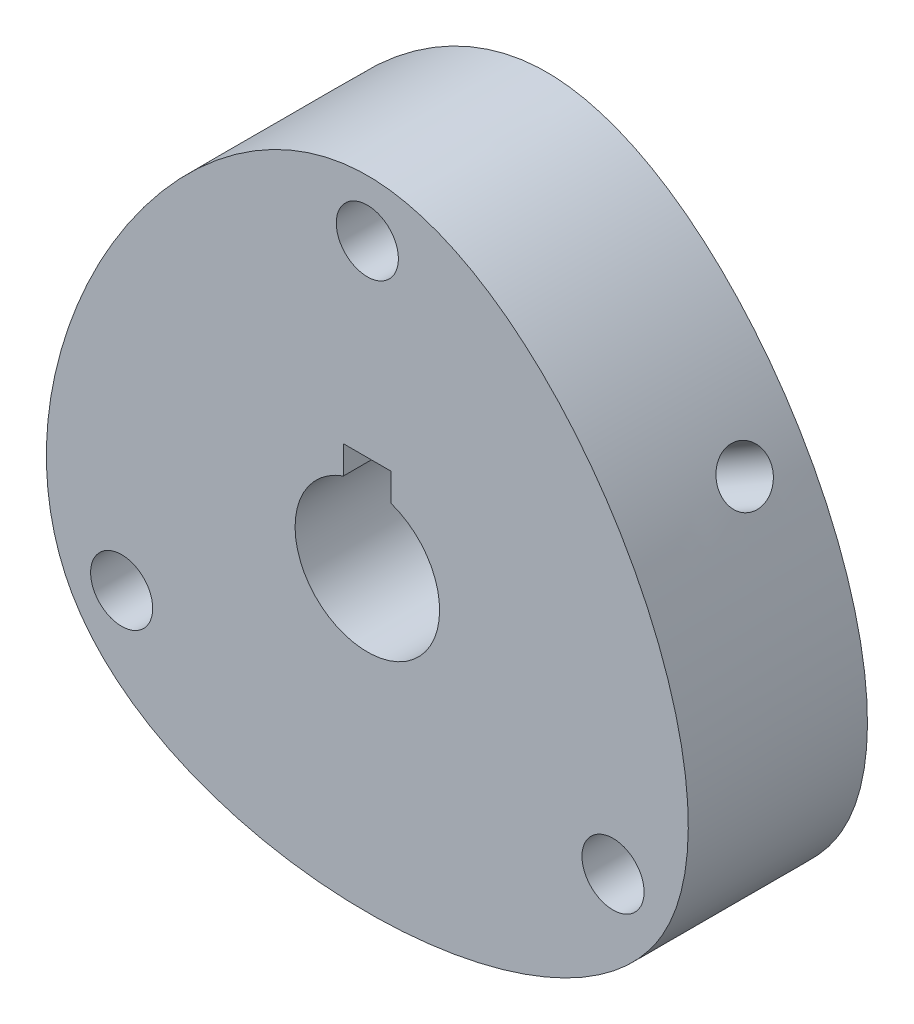
ISO-10303-21;
HEADER;
FILE_DESCRIPTION(('STEP AP214'),'2;1');
FILE_NAME('part.step','',(''),(''),'','','');
FILE_SCHEMA(('AUTOMOTIVE_DESIGN { 1 0 10303 214 1 1 1 1 }'));
ENDSEC;
DATA;
#1=APPLICATION_CONTEXT('core data for automotive mechanical design processes');
#2=APPLICATION_PROTOCOL_DEFINITION('international standard','automotive_design',2000,#1);
#3=PRODUCT_CONTEXT('',#1,'mechanical');
#4=PRODUCT('Part','Part','',(#3));
#5=PRODUCT_RELATED_PRODUCT_CATEGORY('part','',(#4));
#6=PRODUCT_DEFINITION_FORMATION('','',#4);
#7=PRODUCT_DEFINITION_CONTEXT('part definition',#1,'design');
#8=PRODUCT_DEFINITION('design','',#6,#7);
#9=PRODUCT_DEFINITION_SHAPE('','',#8);
#10=(LENGTH_UNIT() NAMED_UNIT(*) SI_UNIT(.MILLI.,.METRE.));
#11=(NAMED_UNIT(*) PLANE_ANGLE_UNIT() SI_UNIT($,.RADIAN.));
#12=(NAMED_UNIT(*) SI_UNIT($,.STERADIAN.) SOLID_ANGLE_UNIT());
#13=UNCERTAINTY_MEASURE_WITH_UNIT(LENGTH_MEASURE(1.E-05),#10,'distance_accuracy_value','');
#14=(GEOMETRIC_REPRESENTATION_CONTEXT(3) GLOBAL_UNCERTAINTY_ASSIGNED_CONTEXT((#13)) GLOBAL_UNIT_ASSIGNED_CONTEXT((#10,
#11,#12)) REPRESENTATION_CONTEXT('',''));
#15=CARTESIAN_POINT('',(0.,0.,0.));
#16=DIRECTION('',(0.,0.,1.));
#17=DIRECTION('',(1.,0.,0.));
#18=AXIS2_PLACEMENT_3D('',#15,#16,#17);
#19=CARTESIAN_POINT('',(0.,23.75,15.));
#20=DIRECTION('',(0.,0.,-1.));
#21=DIRECTION('',(-1.,0.,0.));
#22=AXIS2_PLACEMENT_3D('',#19,#20,#21);
#23=CYLINDRICAL_SURFACE('',#22,2.6);
#24=CARTESIAN_POINT('',(0.,23.75,15.));
#25=DIRECTION('',(0.,0.,1.));
#26=DIRECTION('',(1.,0.,0.));
#27=AXIS2_PLACEMENT_3D('',#24,#25,#26);
#28=CIRCLE('',#27,2.6);
#29=CARTESIAN_POINT('',(2.6,23.75,15.));
#30=VERTEX_POINT('',#29);
#31=EDGE_CURVE('E399',#30,#30,#28,.T.);
#32=ORIENTED_EDGE('',*,*,#31,.T.);
#33=EDGE_LOOP('',(#32));
#34=FACE_BOUND('',#33,.T.);
#35=CARTESIAN_POINT('',(0.,23.75,5.2));
#36=DIRECTION('',(0.,0.,-1.));
#37=DIRECTION('',(-1.,0.,0.));
#38=AXIS2_PLACEMENT_3D('',#35,#36,#37);
#39=CIRCLE('',#38,2.6);
#40=CARTESIAN_POINT('',(-2.6,23.75,5.2));
#41=VERTEX_POINT('',#40);
#42=EDGE_CURVE('E40',#41,#41,#39,.T.);
#43=ORIENTED_EDGE('',*,*,#42,.T.);
#44=EDGE_LOOP('',(#43));
#45=FACE_BOUND('',#44,.T.);
#46=ADVANCED_FACE('F35',(#34,#45),#23,.F.);
#47=CARTESIAN_POINT('',(-20.5681033398804,-11.875,15.));
#48=DIRECTION('',(0.,0.,-1.));
#49=DIRECTION('',(-1.,0.,0.));
#50=AXIS2_PLACEMENT_3D('',#47,#48,#49);
#51=CYLINDRICAL_SURFACE('',#50,2.6);
#52=CARTESIAN_POINT('',(-20.5681033398804,-11.875,15.));
#53=DIRECTION('',(0.,0.,1.));
#54=DIRECTION('',(1.,0.,0.));
#55=AXIS2_PLACEMENT_3D('',#52,#53,#54);
#56=CIRCLE('',#55,2.6);
#57=CARTESIAN_POINT('',(-17.9681033398804,-11.875,15.));
#58=VERTEX_POINT('',#57);
#59=EDGE_CURVE('E112',#58,#58,#56,.T.);
#60=ORIENTED_EDGE('',*,*,#59,.T.);
#61=EDGE_LOOP('',(#60));
#62=FACE_BOUND('',#61,.T.);
#63=CARTESIAN_POINT('',(-20.5681033398804,-11.875,5.2));
#64=DIRECTION('',(0.,0.,-1.));
#65=DIRECTION('',(-1.,0.,0.));
#66=AXIS2_PLACEMENT_3D('',#63,#64,#65);
#67=CIRCLE('',#66,2.6);
#68=CARTESIAN_POINT('',(-23.1681033398804,-11.875,5.2));
#69=VERTEX_POINT('',#68);
#70=EDGE_CURVE('E227',#69,#69,#67,.T.);
#71=ORIENTED_EDGE('',*,*,#70,.T.);
#72=EDGE_LOOP('',(#71));
#73=FACE_BOUND('',#72,.T.);
#74=ADVANCED_FACE('F125',(#62,#73),#51,.F.);
#75=CARTESIAN_POINT('',(20.5681033398804,-11.875,15.));
#76=DIRECTION('',(0.,0.,-1.));
#77=DIRECTION('',(-1.,0.,0.));
#78=AXIS2_PLACEMENT_3D('',#75,#76,#77);
#79=CYLINDRICAL_SURFACE('',#78,2.6);
#80=CARTESIAN_POINT('',(20.5681033398804,-11.875,15.));
#81=DIRECTION('',(0.,0.,1.));
#82=DIRECTION('',(1.,0.,0.));
#83=AXIS2_PLACEMENT_3D('',#80,#81,#82);
#84=CIRCLE('',#83,2.6);
#85=CARTESIAN_POINT('',(23.1681033398804,-11.875,15.));
#86=VERTEX_POINT('',#85);
#87=EDGE_CURVE('E183',#86,#86,#84,.T.);
#88=ORIENTED_EDGE('',*,*,#87,.T.);
#89=EDGE_LOOP('',(#88));
#90=FACE_BOUND('',#89,.T.);
#91=CARTESIAN_POINT('',(20.5681033398804,-11.875,5.2));
#92=DIRECTION('',(0.,0.,-1.));
#93=DIRECTION('',(-1.,0.,0.));
#94=AXIS2_PLACEMENT_3D('',#91,#92,#93);
#95=CIRCLE('',#94,2.6);
#96=CARTESIAN_POINT('',(17.9681033398804,-11.875,5.2));
#97=VERTEX_POINT('',#96);
#98=EDGE_CURVE('E141',#97,#97,#95,.T.);
#99=ORIENTED_EDGE('',*,*,#98,.T.);
#100=EDGE_LOOP('',(#99));
#101=FACE_BOUND('',#100,.T.);
#102=ADVANCED_FACE('F199',(#90,#101),#79,.F.);
#103=CARTESIAN_POINT('',(0.,0.,15.));
#104=DIRECTION('',(0.,0.,-1.));
#105=DIRECTION('',(-1.,0.,0.));
#106=AXIS2_PLACEMENT_3D('',#103,#104,#105);
#107=CYLINDRICAL_SURFACE('',#106,6.05);
#108=CARTESIAN_POINT('',(5.97244831519435,0.965588484983228,5.));
#109=CARTESIAN_POINT('',(5.97244771981132,0.965585419713385,5.11659586544028));
#110=CARTESIAN_POINT('',(5.97084696948032,0.975652573765686,5.23317539328625));
#111=CARTESIAN_POINT('',(5.96422678073495,1.0153307451302,5.46284883688186));
#112=CARTESIAN_POINT('',(5.95920714520985,1.04494288927667,5.57594255126916));
#113=CARTESIAN_POINT('',(5.94516620442357,1.12205854814759,5.79527277586522));
#114=CARTESIAN_POINT('',(5.93615361852759,1.16952304494284,5.90152365281275));
#115=CARTESIAN_POINT('',(5.91327061552294,1.28020047395786,6.10490377429607));
#116=CARTESIAN_POINT('',(5.89939891241414,1.3434175739371,6.20203059544692));
#117=CARTESIAN_POINT('',(5.86513679276748,1.48601825471943,6.38873234440809));
#118=CARTESIAN_POINT('',(5.84450523150246,1.56595266070364,6.47784242289391));
#119=CARTESIAN_POINT('',(5.79584765984202,1.73740692640381,6.64178119514703));
#120=CARTESIAN_POINT('',(5.76782027254636,1.82892894176309,6.71660722514055));
#121=CARTESIAN_POINT('',(5.70254189281029,2.02344695255257,6.85202948964839));
#122=CARTESIAN_POINT('',(5.66503852831487,2.1267055014499,6.91212927946174));
#123=CARTESIAN_POINT('',(5.58084051304245,2.33874012089978,7.0130893564337));
#124=CARTESIAN_POINT('',(5.53414870852933,2.44751447511884,7.05395558822756));
#125=CARTESIAN_POINT('',(5.43391247084311,2.66244213100865,7.11368448649912));
#126=CARTESIAN_POINT('',(5.38070763625974,2.76853146474855,7.13334551320456));
#127=CARTESIAN_POINT('',(5.26724956321482,2.97872940348406,7.15265447122058));
#128=CARTESIAN_POINT('',(5.20699838990949,3.0828385784806,7.15230825170187));
#129=CARTESIAN_POINT('',(5.0841597840251,3.28128665504444,7.13209763001628));
#130=CARTESIAN_POINT('',(5.02179563787072,3.37585417227358,7.1131024992434));
#131=CARTESIAN_POINT('',(4.89453708844871,3.55785661367906,7.0575834744504));
#132=CARTESIAN_POINT('',(4.82964250910467,3.64529104019624,7.02105835862552));
#133=CARTESIAN_POINT('',(4.69886122884479,3.81243106385862,6.93106330844271));
#134=CARTESIAN_POINT('',(4.63297332805241,3.892011685249,6.87736387682733));
#135=CARTESIAN_POINT('',(4.50374905126712,4.04085060858665,6.75474038151916));
#136=CARTESIAN_POINT('',(4.44041345487007,4.11010577382511,6.68581170714428));
#137=CARTESIAN_POINT('',(4.31574925558461,4.24092033146412,6.53040329005567));
#138=CARTESIAN_POINT('',(4.25470525957844,4.30187674715703,6.44318657796364));
#139=CARTESIAN_POINT('',(4.14152518925484,4.41094795305225,6.25585600479975));
#140=CARTESIAN_POINT('',(4.08939090684025,4.45906016114569,6.15573955644468));
#141=CARTESIAN_POINT('',(3.99623065767715,4.54275775188828,5.94308249055152));
#142=CARTESIAN_POINT('',(3.95542334979798,4.57810006752653,5.83034944371705));
#143=CARTESIAN_POINT('',(3.8890992223321,4.63457954224353,5.59710300049913));
#144=CARTESIAN_POINT('',(3.86357492841652,4.65572364573236,5.47659343930491));
#145=CARTESIAN_POINT('',(3.83070653238309,4.68280052508061,5.23772262205738));
#146=CARTESIAN_POINT('',(3.82251046474467,4.68944667794386,5.11955953806098));
#147=CARTESIAN_POINT('',(3.82238691750951,4.68954815163417,4.88323348212841));
#148=CARTESIAN_POINT('',(3.83045593962798,4.68300630892661,4.76507051563309));
#149=CARTESIAN_POINT('',(3.8615585275753,4.65738530989887,4.53715060541383));
#150=CARTESIAN_POINT('',(3.88396664694414,4.6388297881963,4.42724751138682));
#151=CARTESIAN_POINT('',(3.94162349910131,4.58993713257892,4.21361329437768));
#152=CARTESIAN_POINT('',(3.97687469636521,4.55959773736682,4.10988336041888));
#153=CARTESIAN_POINT('',(4.05953287774042,4.48618338105912,3.90752765365013));
#154=CARTESIAN_POINT('',(4.10732060143038,4.4427015168377,3.80920564627256));
#155=CARTESIAN_POINT('',(4.21176652798219,4.34381026702985,3.62391143962561));
#156=CARTESIAN_POINT('',(4.26842767929386,4.28839691456284,3.53694303058937));
#157=CARTESIAN_POINT('',(4.3912290648617,4.16266019483474,3.37179358243095));
#158=CARTESIAN_POINT('',(4.45772200792917,4.09167683694986,3.29437483125167));
#159=CARTESIAN_POINT('',(4.59429708701993,3.93770360650056,3.15645987818752));
#160=CARTESIAN_POINT('',(4.66437915695601,3.85471395495882,3.09596336484297));
#161=CARTESIAN_POINT('',(4.80453127458454,3.67852809255095,2.99409991418072));
#162=CARTESIAN_POINT('',(4.874599440804,3.58538795144162,2.95263388366826));
#163=CARTESIAN_POINT('',(5.01199254535893,3.3906638634777,2.88995298464641));
#164=CARTESIAN_POINT('',(5.07931861489483,3.28908345216744,2.86872968269049));
#165=CARTESIAN_POINT('',(5.20510028219489,3.08592782907337,2.84797500158163));
#166=CARTESIAN_POINT('',(5.26383671324706,2.98463655226482,2.84735560826681));
#167=CARTESIAN_POINT('',(5.37466335455287,2.78011117061156,2.86508321951115));
#168=CARTESIAN_POINT('',(5.42675423295139,2.67687726227879,2.88342831568673));
#169=CARTESIAN_POINT('',(5.52225567920012,2.47377186816294,2.93781736398546));
#170=CARTESIAN_POINT('',(5.5658195525842,2.37387449049164,2.97349850306937));
#171=CARTESIAN_POINT('',(5.64523880026349,2.17828660232481,3.06119873936777));
#172=CARTESIAN_POINT('',(5.6810927305372,2.08259688256101,3.11322089266456));
#173=CARTESIAN_POINT('',(5.74661089553961,1.89453845598762,3.23449818636999));
#174=CARTESIAN_POINT('',(5.77597167770284,1.80245387516408,3.30435724114969));
#175=CARTESIAN_POINT('',(5.82734665486087,1.62872721644777,3.45833794756986));
#176=CARTESIAN_POINT('',(5.84935834341526,1.54708870707599,3.54246445046468));
#177=CARTESIAN_POINT('',(5.88787712480879,1.39354339266074,3.7272170059704));
#178=CARTESIAN_POINT('',(5.90408359778167,1.32225889809042,3.82842499247325));
#179=CARTESIAN_POINT('',(5.93071957249091,1.1971525249264,4.04182481914493));
#180=CARTESIAN_POINT('',(5.94114955462423,1.14332919434407,4.15401574501349));
#181=CARTESIAN_POINT('',(5.95732407941024,1.05583546361744,4.3864066902539));
#182=CARTESIAN_POINT('',(5.96306707770131,1.0221717070266,4.5066093353878));
#183=CARTESIAN_POINT('',(5.97062855500023,0.977055275373253,4.75121557224694));
#184=CARTESIAN_POINT('',(5.97244895034105,0.965591754972302,4.8756170824911));
#185=CARTESIAN_POINT('',(5.97244831519435,0.965588484983228,5.));
#186=B_SPLINE_CURVE_WITH_KNOTS('',3,(#108,#109,#110,#111,#112,#113,#114,#115,#116,#117,#118,
#119,#120,#121,#122,#123,#124,#125,#126,#127,#128,#129,#130,#131,#132,#133,#134,#135,#136,#137,
#138,#139,#140,#141,#142,#143,#144,#145,#146,#147,#148,#149,#150,#151,#152,#153,#154,#155,#156,
#157,#158,#159,#160,#161,#162,#163,#164,#165,#166,#167,#168,#169,#170,#171,#172,#173,#174,#175,
#176,#177,#178,#179,#180,#181,#182,#183,#184,#185),.UNSPECIFIED.,.T.,.F.,(4,2,2,2,2,2,2,2,2,2,2,
2,2,2,2,2,2,2,2,2,2,2,2,2,2,2,2,2,2,2,2,2,2,2,2,2,2,2,4),(0.,0.349325657481159,0.69867145651791,
1.04725812413832,1.39593711750423,1.75873049447988,2.121591461357,2.49538102610081,
2.86905498538956,3.22810840741912,3.58705685977379,3.93003161639104,4.27303028113269,
4.62081862153457,4.9687124001496,5.33505757214899,5.70147633623193,6.07454190109645,
6.44742486473319,6.80150211123779,7.1555032111669,7.49502796165894,7.83461789835866,
8.18603987565901,8.53757887168226,8.90875587121735,9.27992603866123,9.64914093230714,
10.0182019378104,10.3677414580296,10.7172458077501,11.0597316712173,11.4022816242666,
11.7584767536817,12.1147932411979,12.4875396332954,12.8602550215989,13.2330931701314,
13.6057491324518),.UNSPECIFIED.);
#187=CARTESIAN_POINT('',(5.97244831519435,0.965588484983228,5.));
#188=VERTEX_POINT('',#187);
#189=EDGE_CURVE('E140',#188,#188,#186,.T.);
#190=ORIENTED_EDGE('',*,*,#189,.F.);
#191=EDGE_LOOP('',(#190));
#192=FACE_BOUND('',#191,.T.);
#193=CARTESIAN_POINT('',(0.,-6.05,7.15));
#194=CARTESIAN_POINT('',(0.11685954706425,-6.05000162471605,7.15000227279329));
#195=CARTESIAN_POINT('',(0.233702893841438,-6.04658384068489,7.1404420271531));
#196=CARTESIAN_POINT('',(0.463921462027798,-6.03328868591722,7.10258993810885));
#197=CARTESIAN_POINT('',(0.577296779091105,-6.02341149351062,7.07429861182799));
#198=CARTESIAN_POINT('',(0.79722699269495,-5.99826411294486,7.00009513692555));
#199=CARTESIAN_POINT('',(0.903793804957312,-5.98300366951455,6.95421481486329));
#200=CARTESIAN_POINT('',(1.10771594043303,-5.94862775927551,6.84628890806543));
#201=CARTESIAN_POINT('',(1.20506907698182,-5.92951138069878,6.78423949899963));
#202=CARTESIAN_POINT('',(1.39157075002002,-5.88858799584403,6.64321986969979));
#203=CARTESIAN_POINT('',(1.48031415377872,-5.8667103511561,6.56373450945163));
#204=CARTESIAN_POINT('',(1.64352981314482,-5.82309712706986,6.39119338695876));
#205=CARTESIAN_POINT('',(1.71799832270236,-5.80136158640426,6.29813407385811));
#206=CARTESIAN_POINT('',(1.85299700953199,-5.75969366828207,6.09727982861095));
#207=CARTESIAN_POINT('',(1.9129771472809,-5.73984600910767,5.98909589880432));
#208=CARTESIAN_POINT('',(2.01371432508248,-5.70528806986687,5.76335783536733));
#209=CARTESIAN_POINT('',(2.05447815624219,-5.69057597535245,5.64580702921732));
#210=CARTESIAN_POINT('',(2.11406437770841,-5.66870453941411,5.40931150016994));
#211=CARTESIAN_POINT('',(2.1336535715237,-5.66128220659322,5.29058507130557));
#212=CARTESIAN_POINT('',(2.15273226252333,-5.65405678409809,5.05131621532847));
#213=CARTESIAN_POINT('',(2.15222901040493,-5.65425094588315,4.93077445900422));
#214=CARTESIAN_POINT('',(2.13172774031689,-5.6620080067235,4.69807385380478));
#215=CARTESIAN_POINT('',(2.1127617929519,-5.66918078712497,4.58580873793769));
#216=CARTESIAN_POINT('',(2.05756876368711,-5.68944338481489,4.36617263168438));
#217=CARTESIAN_POINT('',(2.02133934661995,-5.7025340025756,4.25880230555219));
#218=CARTESIAN_POINT('',(1.93202944419125,-5.73341263160136,4.04978428733352));
#219=CARTESIAN_POINT('',(1.87866308917942,-5.75127940164856,3.94827088590289));
#220=CARTESIAN_POINT('',(1.75679290602166,-5.78966768696037,3.75532764386216));
#221=CARTESIAN_POINT('',(1.68828424641723,-5.81019004867686,3.66390103563714));
#222=CARTESIAN_POINT('',(1.53323864218499,-5.85307752829527,3.48797041137112));
#223=CARTESIAN_POINT('',(1.44586796312758,-5.87547941477437,3.40420846125266));
#224=CARTESIAN_POINT('',(1.25805190204249,-5.9185367527603,3.25231769213817));
#225=CARTESIAN_POINT('',(1.15760490202315,-5.93919198762354,3.18419081062605));
#226=CARTESIAN_POINT('',(0.944750142667555,-5.97676809449433,3.06479527118361));
#227=CARTESIAN_POINT('',(0.832207432430128,-5.99363854750599,3.01375022161272));
#228=CARTESIAN_POINT('',(0.59938601370949,-6.02137457069691,2.93155617510036));
#229=CARTESIAN_POINT('',(0.479110397602102,-6.03224252479474,2.90039927872562));
#230=CARTESIAN_POINT('',(0.240500650237159,-6.04634160983193,2.86023806124962));
#231=CARTESIAN_POINT('',(0.122355156230434,-6.04991748195415,2.85023286328208));
#232=CARTESIAN_POINT('',(-0.113965696996356,-6.05007960980243,2.84977532051567));
#233=CARTESIAN_POINT('',(-0.23214104586608,-6.04666723150715,2.85931915450859));
#234=CARTESIAN_POINT('',(-0.460997126932928,-6.03346413079156,2.89691191542168));
#235=CARTESIAN_POINT('',(-0.571796189687052,-6.0238926142918,2.92432527985891));
#236=CARTESIAN_POINT('',(-0.787161248865454,-5.99955259430939,2.99606264524754));
#237=CARTESIAN_POINT('',(-0.891726434525941,-5.98478341654766,3.04038884031937));
#238=CARTESIAN_POINT('',(-1.09493705784729,-5.95101051511189,3.14605922334984));
#239=CARTESIAN_POINT('',(-1.19333382708919,-5.9318995325128,3.2078463181457));
#240=CARTESIAN_POINT('',(-1.37867541080675,-5.89158423881047,3.34617508553368));
#241=CARTESIAN_POINT('',(-1.46561631051171,-5.87037921642728,3.42272177996904));
#242=CARTESIAN_POINT('',(-1.63029141223562,-5.82685869266236,3.59308805146525));
#243=CARTESIAN_POINT('',(-1.70731268520447,-5.8045427303509,3.68759837281453));
#244=CARTESIAN_POINT('',(-1.84451766933568,-5.76241456766417,3.8886646091873));
#245=CARTESIAN_POINT('',(-1.90470061802082,-5.74260248069228,3.9952210693804));
#246=CARTESIAN_POINT('',(-2.00639431764525,-5.70787071621565,4.21778805165161));
#247=CARTESIAN_POINT('',(-2.04789014867149,-5.69295495053105,4.33380604090307));
#248=CARTESIAN_POINT('',(-2.11052427100301,-5.67003715060351,4.57184961981222));
#249=CARTESIAN_POINT('',(-2.13167344542676,-5.66203142052307,4.69387196107598));
#250=CARTESIAN_POINT('',(-2.15209781819326,-5.65429770023276,4.93282585728175));
#251=CARTESIAN_POINT('',(-2.15257276597692,-5.65411569811323,5.04964116404351));
#252=CARTESIAN_POINT('',(-2.13465064430675,-5.66090597356829,5.28159203284124));
#253=CARTESIAN_POINT('',(-2.11625501448881,-5.6678777053847,5.39672772233559));
#254=CARTESIAN_POINT('',(-2.06200931908581,-5.687830485031,5.61920279139204));
#255=CARTESIAN_POINT('',(-2.02659945125339,-5.70065959320113,5.72666424821207));
#256=CARTESIAN_POINT('',(-1.93970195228939,-5.7308080806381,5.93419492096076));
#257=CARTESIAN_POINT('',(-1.88821047313843,-5.74812853442878,6.03426236054965));
#258=CARTESIAN_POINT('',(-1.76771393744568,-5.78635127501658,6.2294173961212));
#259=CARTESIAN_POINT('',(-1.69798239496537,-5.80738626477897,6.32403019641335));
#260=CARTESIAN_POINT('',(-1.54415899672661,-5.85016575920228,6.50059707113521));
#261=CARTESIAN_POINT('',(-1.46006282035469,-5.87191047573928,6.58254732274059));
#262=CARTESIAN_POINT('',(-1.27520722872042,-5.91487512690369,6.73533254626113));
#263=CARTESIAN_POINT('',(-1.17385434135507,-5.9360235065913,6.8054724673675));
#264=CARTESIAN_POINT('',(-0.960073447181083,-5.97432292821717,6.92766993474983));
#265=CARTESIAN_POINT('',(-0.847646437940961,-5.99147432973978,6.9797291078499));
#266=CARTESIAN_POINT('',(-0.614769712489446,-6.0198261407075,7.06394978635918));
#267=CARTESIAN_POINT('',(-0.494316516108562,-6.03102394951845,7.09610259732565));
#268=CARTESIAN_POINT('',(-0.249235002138689,-6.04610862243574,7.13912244391695));
#269=CARTESIAN_POINT('',(-0.124608291099734,-6.04999826755198,7.14999757650192));
#270=CARTESIAN_POINT('',(0.,-6.05,7.15));
#271=B_SPLINE_CURVE_WITH_KNOTS('',3,(#193,#194,#195,#196,#197,#198,#199,#200,#201,#202,#203,
#204,#205,#206,#207,#208,#209,#210,#211,#212,#213,#214,#215,#216,#217,#218,#219,#220,#221,#222,
#223,#224,#225,#226,#227,#228,#229,#230,#231,#232,#233,#234,#235,#236,#237,#238,#239,#240,#241,
#242,#243,#244,#245,#246,#247,#248,#249,#250,#251,#252,#253,#254,#255,#256,#257,#258,#259,#260,
#261,#262,#263,#264,#265,#266,#267,#268,#269,#270),.UNSPECIFIED.,.T.,.F.,(4,2,2,2,2,2,2,2,2,2,2,
2,2,2,2,2,2,2,2,2,2,2,2,2,2,2,2,2,2,2,2,2,2,2,2,2,2,2,4),(0.,0.350119520609915,
0.700229375606741,1.04970868882891,1.39927073642637,1.7610375116672,2.12289909298173,
2.49687411030509,2.87071686434138,3.23051430802107,3.59018191391196,3.93083434195683,
4.27153286191497,4.61823890379878,4.96505572936189,5.33263452286171,5.70025884183605,
6.07252272597021,6.44463865737525,6.79871152206552,7.15271518348139,7.49476854868075,
7.83686630394195,8.18856998048363,8.54039353340032,8.91049441224189,9.28061204737267,
9.65102466512862,10.0212390444476,10.369938957522,10.718612270267,11.0587141765997,
11.3988975251879,11.7555308356047,12.1122716041567,12.4856197275885,12.8589342501333,
13.2324117093393,13.6057470186048),.UNSPECIFIED.);
#272=CARTESIAN_POINT('',(0.,-6.05,7.15));
#273=VERTEX_POINT('',#272);
#274=EDGE_CURVE('E159',#273,#273,#271,.T.);
#275=ORIENTED_EDGE('',*,*,#274,.F.);
#276=EDGE_LOOP('',(#275));
#277=FACE_BOUND('',#276,.T.);
#278=CARTESIAN_POINT('',(0.,0.,0.));
#279=DIRECTION('',(0.,0.,1.));
#280=DIRECTION('',(1.,0.,0.));
#281=AXIS2_PLACEMENT_3D('',#278,#279,#280);
#282=CIRCLE('',#281,6.05);
#283=CARTESIAN_POINT('',(-2.,5.70985989320228,0.));
#284=VERTEX_POINT('',#283);
#285=CARTESIAN_POINT('',(2.,5.70985989320228,0.));
#286=VERTEX_POINT('',#285);
#287=EDGE_CURVE('E165',#284,#286,#282,.T.);
#288=ORIENTED_EDGE('',*,*,#287,.F.);
#289=DIRECTION('',(0.,0.,-1.));
#290=VECTOR('',#289,1.);
#291=CARTESIAN_POINT('',(-2.,5.70985989320228,15.));
#292=LINE('',#291,#290);
#293=CARTESIAN_POINT('',(-2.,5.70985989320228,15.));
#294=VERTEX_POINT('',#293);
#295=EDGE_CURVE('E46',#294,#284,#292,.T.);
#296=ORIENTED_EDGE('',*,*,#295,.F.);
#297=CARTESIAN_POINT('',(0.,0.,15.));
#298=DIRECTION('',(0.,0.,1.));
#299=DIRECTION('',(1.,0.,0.));
#300=AXIS2_PLACEMENT_3D('',#297,#298,#299);
#301=CIRCLE('',#300,6.05);
#302=CARTESIAN_POINT('',(2.,5.70985989320228,15.));
#303=VERTEX_POINT('',#302);
#304=EDGE_CURVE('E89',#294,#303,#301,.T.);
#305=ORIENTED_EDGE('',*,*,#304,.T.);
#306=DIRECTION('',(0.,0.,-1.));
#307=VECTOR('',#306,1.);
#308=CARTESIAN_POINT('',(2.,5.70985989320228,15.));
#309=LINE('',#308,#307);
#310=EDGE_CURVE('E55',#303,#286,#309,.T.);
#311=ORIENTED_EDGE('',*,*,#310,.T.);
#312=EDGE_LOOP('',(#288,#296,#305,#311));
#313=FACE_BOUND('',#312,.T.);
#314=ADVANCED_FACE('F37',(#192,#277,#313),#107,.F.);
#315=CARTESIAN_POINT('',(-2.,0.,15.));
#316=DIRECTION('',(-1.,0.,0.));
#317=DIRECTION('',(0.,0.,1.));
#318=AXIS2_PLACEMENT_3D('',#315,#316,#317);
#319=PLANE('',#318);
#320=DIRECTION('',(0.,1.,0.));
#321=VECTOR('',#320,1.);
#322=CARTESIAN_POINT('',(-2.,0.,0.));
#323=LINE('',#322,#321);
#324=CARTESIAN_POINT('',(-2.,8.05,0.));
#325=VERTEX_POINT('',#324);
#326=EDGE_CURVE('E96',#284,#325,#323,.T.);
#327=ORIENTED_EDGE('',*,*,#326,.T.);
#328=DIRECTION('',(0.,0.,-1.));
#329=VECTOR('',#328,1.);
#330=CARTESIAN_POINT('',(-2.,8.05,15.));
#331=LINE('',#330,#329);
#332=CARTESIAN_POINT('',(-2.,8.05,15.));
#333=VERTEX_POINT('',#332);
#334=EDGE_CURVE('E93',#333,#325,#331,.T.);
#335=ORIENTED_EDGE('',*,*,#334,.F.);
#336=DIRECTION('',(0.,1.,0.));
#337=VECTOR('',#336,1.);
#338=CARTESIAN_POINT('',(-2.,0.,15.));
#339=LINE('',#338,#337);
#340=EDGE_CURVE('E82',#294,#333,#339,.T.);
#341=ORIENTED_EDGE('',*,*,#340,.F.);
#342=ORIENTED_EDGE('',*,*,#295,.T.);
#343=EDGE_LOOP('',(#327,#335,#341,#342));
#344=FACE_BOUND('',#343,.T.);
#345=ADVANCED_FACE('F94',(#344),#319,.F.);
#346=CARTESIAN_POINT('',(0.,8.05,15.));
#347=DIRECTION('',(0.,1.,0.));
#348=DIRECTION('',(0.,0.,1.));
#349=AXIS2_PLACEMENT_3D('',#346,#347,#348);
#350=PLANE('',#349);
#351=DIRECTION('',(1.,0.,0.));
#352=VECTOR('',#351,1.);
#353=CARTESIAN_POINT('',(0.,8.05,0.));
#354=LINE('',#353,#352);
#355=CARTESIAN_POINT('',(2.,8.05,0.));
#356=VERTEX_POINT('',#355);
#357=EDGE_CURVE('E173',#325,#356,#354,.T.);
#358=ORIENTED_EDGE('',*,*,#357,.T.);
#359=DIRECTION('',(0.,0.,-1.));
#360=VECTOR('',#359,1.);
#361=CARTESIAN_POINT('',(2.,8.05,15.));
#362=LINE('',#361,#360);
#363=CARTESIAN_POINT('',(2.,8.05,15.));
#364=VERTEX_POINT('',#363);
#365=EDGE_CURVE('E70',#364,#356,#362,.T.);
#366=ORIENTED_EDGE('',*,*,#365,.F.);
#367=DIRECTION('',(1.,0.,0.));
#368=VECTOR('',#367,1.);
#369=CARTESIAN_POINT('',(0.,8.05,15.));
#370=LINE('',#369,#368);
#371=EDGE_CURVE('E88',#333,#364,#370,.T.);
#372=ORIENTED_EDGE('',*,*,#371,.F.);
#373=ORIENTED_EDGE('',*,*,#334,.T.);
#374=EDGE_LOOP('',(#358,#366,#372,#373));
#375=FACE_BOUND('',#374,.T.);
#376=ADVANCED_FACE('F100',(#375),#350,.F.);
#377=CARTESIAN_POINT('',(24.6817240078565,-14.25,15.));
#378=CARTESIAN_POINT('',(32.9089653438087,0.,15.));
#379=CARTESIAN_POINT('',(0.,57.,15.));
#380=CARTESIAN_POINT('',(-49.363448015713,-28.5,15.));
#381=CARTESIAN_POINT('',(16.4544826719043,-28.5,15.));
#382=CARTESIAN_POINT('',(24.6817240078565,-14.25,15.));
#383=B_SPLINE_CURVE_WITH_KNOTS('',3,(#377,#378,#379,#380,#381,#382),.UNSPECIFIED.,.T.,.F.,(4,1,
1,4),(0.,0.333333333333333,0.666666666666667,1.),.UNSPECIFIED.);
#384=DIRECTION('',(0.,0.,-1.));
#385=VECTOR('',#384,1.);
#386=SURFACE_OF_LINEAR_EXTRUSION('',#383,#385);
#387=CARTESIAN_POINT('',(22.6264726580893,10.5807939224443,5.));
#388=CARTESIAN_POINT('',(22.6264706021947,10.580798888184,5.12069059964099));
#389=CARTESIAN_POINT('',(22.6218055310068,10.5898733872771,5.24146691534448));
#390=CARTESIAN_POINT('',(22.6032260565713,10.6259242554312,5.47968808563075));
#391=CARTESIAN_POINT('',(22.5893007405641,10.6529217458252,5.59712883894605));
#392=CARTESIAN_POINT('',(22.5524940144697,10.7239827378663,5.82519352276099));
#393=CARTESIAN_POINT('',(22.5296171521943,10.7680375734506,5.9358208818095));
#394=CARTESIAN_POINT('',(22.4754014230746,10.8718558324676,6.14715091531191));
#395=CARTESIAN_POINT('',(22.4440645603172,10.9316155354903,6.24785593256409));
#396=CARTESIAN_POINT('',(22.3735843619719,11.065095375657,6.43660920235936));
#397=CARTESIAN_POINT('',(22.3344345126402,11.1388271588212,6.52464678786118));
#398=CARTESIAN_POINT('',(22.2492351880094,11.2980095188211,6.68547520897181));
#399=CARTESIAN_POINT('',(22.203185432164,11.383460572144,6.75826542434215));
#400=CARTESIAN_POINT('',(22.1052599671435,11.5635840191752,6.88656127510339));
#401=CARTESIAN_POINT('',(22.0533815283118,11.6582607306155,6.94205876576812));
#402=CARTESIAN_POINT('',(21.9451123347464,11.8540146275205,7.03414145995775));
#403=CARTESIAN_POINT('',(21.8887216125153,11.9550917668809,7.07072679969509));
#404=CARTESIAN_POINT('',(21.7729521985342,12.1606213697838,7.12391888435701));
#405=CARTESIAN_POINT('',(21.7135759011109,12.2650711053033,7.14054138071646));
#406=CARTESIAN_POINT('',(21.593424080505,12.4744184929901,7.15338454432416));
#407=CARTESIAN_POINT('',(21.5326485677592,12.5793161418116,7.14960536370094));
#408=CARTESIAN_POINT('',(21.4114905180037,12.7864977348262,7.12176548274443));
#409=CARTESIAN_POINT('',(21.3511076959609,12.8887837822415,7.09772166950456));
#410=CARTESIAN_POINT('',(21.2324795793557,13.0879804872767,7.03006122042289));
#411=CARTESIAN_POINT('',(21.1742342932896,13.1848911235314,6.98644450679261));
#412=CARTESIAN_POINT('',(21.0616506246882,13.3707158019603,6.8808571422602));
#413=CARTESIAN_POINT('',(21.0073138916589,13.4596264718761,6.81887879812188));
#414=CARTESIAN_POINT('',(20.9042995019412,13.6270012299332,6.67833314957708));
#415=CARTESIAN_POINT('',(20.8556218825616,13.7054652492034,6.59976573581354));
#416=CARTESIAN_POINT('',(20.7654682203909,13.8499261598829,6.42817652651249));
#417=CARTESIAN_POINT('',(20.7239995834644,13.915910236563,6.33514005042795));
#418=CARTESIAN_POINT('',(20.6497141874328,14.0335643146971,6.13730525134357));
#419=CARTESIAN_POINT('',(20.6168974305965,14.0852343123977,6.03250692525964));
#420=CARTESIAN_POINT('',(20.5610375496061,14.1729019617604,5.81411408927625));
#421=CARTESIAN_POINT('',(20.5379947393468,14.2088991100827,5.70051929701276));
#422=CARTESIAN_POINT('',(20.5024861374478,14.2642737825179,5.46776228912001));
#423=CARTESIAN_POINT('',(20.4900202708799,14.283651424365,5.34860011293693));
#424=CARTESIAN_POINT('',(20.4761108596348,14.3052686190514,5.10822030771946));
#425=CARTESIAN_POINT('',(20.4746561501207,14.3075255315746,4.98700488564936));
#426=CARTESIAN_POINT('',(20.4827908666177,14.2948880690011,4.74584572431827));
#427=CARTESIAN_POINT('',(20.492380258579,14.2799937467829,4.62590198113776));
#428=CARTESIAN_POINT('',(20.5222586685361,14.2334546523609,4.3907489671549));
#429=CARTESIAN_POINT('',(20.5425425916187,14.2018178563052,4.27553747004156));
#430=CARTESIAN_POINT('',(20.5931009736151,14.1226259315207,4.0530508155844));
#431=CARTESIAN_POINT('',(20.6233754870202,14.0750707159688,3.94577570153152));
#432=CARTESIAN_POINT('',(20.6929054895086,13.9652438771448,3.74211189878686));
#433=CARTESIAN_POINT('',(20.7321682124993,13.902960398907,3.64573207270292));
#434=CARTESIAN_POINT('',(20.8183397123815,13.7653412188852,3.46668389354518));
#435=CARTESIAN_POINT('',(20.8652485350109,13.6900054390239,3.38401562249799));
#436=CARTESIAN_POINT('',(20.9652115354516,13.5282204717169,3.23466810877343));
#437=CARTESIAN_POINT('',(21.0182707675149,13.4417621375356,3.16800215652654));
#438=CARTESIAN_POINT('',(21.1288012842277,13.2601162089763,3.05264255954464));
#439=CARTESIAN_POINT('',(21.1862725505351,13.1649286508875,3.00394884009923));
#440=CARTESIAN_POINT('',(21.3038116337293,12.9684774242575,2.92593926462787));
#441=CARTESIAN_POINT('',(21.363878293141,12.8672164566303,2.89661486352907));
#442=CARTESIAN_POINT('',(21.4848238308448,12.6613998318265,2.85814831234656));
#443=CARTESIAN_POINT('',(21.5457027049668,12.5568441915617,2.84900605868283));
#444=CARTESIAN_POINT('',(21.6664464814498,12.3475014615339,2.85116432095263));
#445=CARTESIAN_POINT('',(21.7263123523707,12.2427147154539,2.8624440487704));
#446=CARTESIAN_POINT('',(21.8434337585383,12.0358016361134,2.90508312760242));
#447=CARTESIAN_POINT('',(21.9006892888648,11.9336753078677,2.93644251646258));
#448=CARTESIAN_POINT('',(22.0110742169652,11.735040023066,3.01834654984829));
#449=CARTESIAN_POINT('',(22.0642035791127,11.6385311150142,3.06889136000339));
#450=CARTESIAN_POINT('',(22.1649938105675,11.4539589829143,3.18772767723331));
#451=CARTESIAN_POINT('',(22.2126548506907,11.3658954950679,3.25601862974812));
#452=CARTESIAN_POINT('',(22.301405030435,11.2007385424488,3.40848255569531));
#453=CARTESIAN_POINT('',(22.3424881591755,11.1236551182505,3.49266990387633));
#454=CARTESIAN_POINT('',(22.4170931469377,10.9828420290685,3.67452960903592));
#455=CARTESIAN_POINT('',(22.4506131417216,10.9191156567408,3.77220528121001));
#456=CARTESIAN_POINT('',(22.5093620987095,10.8069170724537,3.97834204988522));
#457=CARTESIAN_POINT('',(22.5345833263526,10.7584590926116,4.08681308588892));
#458=CARTESIAN_POINT('',(22.576126503894,10.6784038854741,4.31130877534168));
#459=CARTESIAN_POINT('',(22.5924589757172,10.6467867240733,4.42732431510042));
#460=CARTESIAN_POINT('',(22.6115981631797,10.6096852851711,4.62005160208174));
#461=CARTESIAN_POINT('',(22.6171705853602,10.5988657586193,4.69551472536965));
#462=CARTESIAN_POINT('',(22.6246084817393,10.5844185091621,4.84730712779336));
#463=CARTESIAN_POINT('',(22.626473958899,10.5807907805117,4.9236364062372));
#464=CARTESIAN_POINT('',(22.6264726580893,10.5807939224443,5.));
#465=B_SPLINE_CURVE_WITH_KNOTS('',3,(#387,#388,#389,#390,#391,#392,#393,#394,#395,#396,#397,
#398,#399,#400,#401,#402,#403,#404,#405,#406,#407,#408,#409,#410,#411,#412,#413,#414,#415,#416,
#417,#418,#419,#420,#421,#422,#423,#424,#425,#426,#427,#428,#429,#430,#431,#432,#433,#434,#435,
#436,#437,#438,#439,#440,#441,#442,#443,#444,#445,#446,#447,#448,#449,#450,#451,#452,#453,#454,
#455,#456,#457,#458,#459,#460,#461,#462,#463,#464),.UNSPECIFIED.,.T.,.F.,(4,2,2,2,2,2,2,2,2,2,2,
2,2,2,2,2,2,2,2,2,2,2,2,2,2,2,2,2,2,2,2,2,2,2,2,2,2,2,4),(0.,0.361793043384102,
0.724013200077185,1.08604957012114,1.44800025262695,1.81025396626436,2.1725224129393,
2.53496122795772,2.89739743251899,3.25954747298714,3.62169481302614,3.98354066345735,
4.3453879519834,4.70738706379812,5.06938856202719,5.43175977838756,5.79413108976611,
6.15651403798467,6.51889441902557,6.88090731275469,7.2429190903763,7.60475855991074,
7.96660000304182,8.3287336943181,8.69086955190819,9.05330514208742,9.41573922560843,
9.77801330877233,10.1402855326473,10.5021891966342,10.8640935427347,11.2260010132602,
11.5878971756786,11.9501221735388,12.3124363589891,12.6750872758236,13.0373079714334,
13.2662225608333,13.4951369673685),.UNSPECIFIED.);
#466=CARTESIAN_POINT('',(22.6264726580893,10.5807939224443,5.));
#467=VERTEX_POINT('',#466);
#468=EDGE_CURVE('E134',#467,#467,#465,.T.);
#469=ORIENTED_EDGE('',*,*,#468,.T.);
#470=EDGE_LOOP('',(#469));
#471=FACE_BOUND('',#470,.T.);
#472=CARTESIAN_POINT('',(0.,-24.9375,7.15));
#473=CARTESIAN_POINT('',(0.120690909300888,-24.9374993076502,7.14999467187735));
#474=CARTESIAN_POINT('',(0.241467533605825,-24.9370041100076,7.1398033390161));
#475=CARTESIAN_POINT('',(0.479689345065111,-24.9350760552524,7.09929241520279));
#476=CARTESIAN_POINT('',(0.597130431195281,-24.9336420919356,7.06894907731852));
#477=CARTESIAN_POINT('',(0.825195818531133,-24.9299982332469,6.98900460028539));
#478=CARTESIAN_POINT('',(0.935823545465052,-24.9277887316186,6.93941323208394));
#479=CARTESIAN_POINT('',(1.14715419446359,-24.9228420019462,6.82239534021039));
#480=CARTESIAN_POINT('',(1.24785945979091,-24.9201048989525,6.75497304136752));
#481=CARTESIAN_POINT('',(1.43661244563447,-24.9144075080997,6.60413556028419));
#482=CARTESIAN_POINT('',(1.52464957859983,-24.911447036671,6.52070713502701));
#483=CARTESIAN_POINT('',(1.68547712746452,-24.9056380672104,6.34025188793351));
#484=CARTESIAN_POINT('',(1.75826692173005,-24.9027895737476,6.24322451193723));
#485=CARTESIAN_POINT('',(1.88656233511628,-24.8975248576197,6.03827054427265));
#486=CARTESIAN_POINT('',(1.94205973133795,-24.8951088408379,5.93033879955299));
#487=CARTESIAN_POINT('',(2.03414222656689,-24.8909843853684,5.70667616371296));
#488=CARTESIAN_POINT('',(2.07072746293592,-24.8892759415414,5.59094532924543));
#489=CARTESIAN_POINT('',(2.12391932719189,-24.8867615779904,5.35506646518459));
#490=CARTESIAN_POINT('',(2.14054169898,-24.885954947078,5.23492199362379));
#491=CARTESIAN_POINT('',(2.15338454469461,-24.8853333961749,4.9935455399231));
#492=CARTESIAN_POINT('',(2.14960517206687,-24.8855184687254,4.87231356596939));
#493=CARTESIAN_POINT('',(2.12176499035226,-24.8868587045065,4.6323108738036));
#494=CARTESIAN_POINT('',(2.09772126155093,-24.8880130507591,4.51353816909246));
#495=CARTESIAN_POINT('',(2.03006133679389,-24.8911599467582,4.28171670400192));
#496=CARTESIAN_POINT('',(1.9864450611614,-24.8931524999169,4.16866796692598));
#497=CARTESIAN_POINT('',(1.88085859682727,-24.8977514881963,3.95144841443942));
#498=CARTESIAN_POINT('',(1.81888061158955,-24.9003581839907,3.84728139452527));
#499=CARTESIAN_POINT('',(1.67833572550786,-24.9058908114029,3.65082374526542));
#500=CARTESIAN_POINT('',(1.59976871553853,-24.9088167451207,3.55853319405153));
#501=CARTESIAN_POINT('',(1.42817978869743,-24.9146614676215,3.38834907634651));
#502=CARTESIAN_POINT('',(1.3351431098572,-24.9175802459809,3.31047039253894));
#503=CARTESIAN_POINT('',(1.13730773604005,-24.9230790185783,3.17143540539341));
#504=CARTESIAN_POINT('',(1.03250903865902,-24.9256590127471,3.11027910547346));
#505=CARTESIAN_POINT('',(0.814116110594281,-24.9301901277381,3.0064264737869));
#506=CARTESIAN_POINT('',(0.700521655734695,-24.9321412325253,2.96373061270087));
#507=CARTESIAN_POINT('',(0.467765379908358,-24.935195102288,2.89802031282916));
#508=CARTESIAN_POINT('',(0.348603597820684,-24.9362978731868,2.87500573662214));
#509=CARTESIAN_POINT('',(0.108223962379117,-24.9375305002936,2.84932956710171));
#510=CARTESIAN_POINT('',(-0.0129916954990314,-24.9376613368737,2.84664746474217));
#511=CARTESIAN_POINT('',(-0.25415137773852,-24.936938012142,2.86165886277588));
#512=CARTESIAN_POINT('',(-0.374095406020688,-24.9360838538681,2.87935230032657));
#513=CARTESIAN_POINT('',(-0.609249769835857,-24.9334870037388,2.93459558960776));
#514=CARTESIAN_POINT('',(-0.724462303297436,-24.9317447296038,2.9721361066843));
#515=CARTESIAN_POINT('',(-0.946950903327465,-24.9275671725341,3.06599843715467));
#516=CARTESIAN_POINT('',(-1.05422692731388,-24.9251318858816,3.12232035130805));
#517=CARTESIAN_POINT('',(-1.25789132909608,-24.919839223404,3.25219910431281));
#518=CARTESIAN_POINT('',(-1.35427094697396,-24.9169815121792,3.32576966582597));
#519=CARTESIAN_POINT('',(-1.53331864740809,-24.9111666195047,3.48803725552697));
#520=CARTESIAN_POINT('',(-1.61598664704189,-24.9082094374534,3.57673437518767));
#521=CARTESIAN_POINT('',(-1.76533360396658,-24.9025262042153,3.76682564434118));
#522=CARTESIAN_POINT('',(-1.83199927168614,-24.8998003463439,3.86823024147121));
#523=CARTESIAN_POINT('',(-1.94735836881985,-24.8948906879644,4.08080515007006));
#524=CARTESIAN_POINT('',(-1.99605187293046,-24.8927068852034,4.19197542094812));
#525=CARTESIAN_POINT('',(-2.07406129928627,-24.8891296618049,4.42087686946773));
#526=CARTESIAN_POINT('',(-2.10338567348168,-24.8877358964628,4.53860516108872));
#527=CARTESIAN_POINT('',(-2.14185203807482,-24.8858955200925,4.77732117885655));
#528=CARTESIAN_POINT('',(-2.15099413413132,-24.8854489041058,4.89830888793624));
#529=CARTESIAN_POINT('',(-2.14883542484278,-24.8855535192046,5.13997660394327));
#530=CARTESIAN_POINT('',(-2.13755559516481,-24.8861037264385,5.26065679924376));
#531=CARTESIAN_POINT('',(-2.09491656799109,-24.8881375608566,5.49840801229119));
#532=CARTESIAN_POINT('',(-2.06355733134286,-24.8896211898607,5.61547902300018));
#533=CARTESIAN_POINT('',(-1.98165387086849,-24.8933538266944,5.84269323345936));
#534=CARTESIAN_POINT('',(-1.93110948168441,-24.8956028411208,5.9528363734883));
#535=CARTESIAN_POINT('',(-1.81227422426018,-24.9006120122155,6.16307440678744));
#536=CARTESIAN_POINT('',(-1.74398390981831,-24.9033721529323,6.26316961348908));
#537=CARTESIAN_POINT('',(-1.59152067147916,-24.9090952354243,6.45057488475101));
#538=CARTESIAN_POINT('',(-1.50733322792794,-24.9120583610069,6.53787313069337));
#539=CARTESIAN_POINT('',(-1.32547313742504,-24.9178521380278,6.69712425665635));
#540=CARTESIAN_POINT('',(-1.22779717632164,-24.9206827566794,6.7690733542748));
#541=CARTESIAN_POINT('',(-1.02166018676389,-24.9258947823439,6.89561511760438));
#542=CARTESIAN_POINT('',(-0.913189270233049,-24.9282757716085,6.95019167453699));
#543=CARTESIAN_POINT('',(-0.688693836912582,-24.9323145641421,7.04029332968677));
#544=CARTESIAN_POINT('',(-0.572678433140684,-24.9339732219326,7.07584095070433));
#545=CARTESIAN_POINT('',(-0.379950823118472,-24.9359419332306,7.11754168188842));
#546=CARTESIAN_POINT('',(-0.304487216166344,-24.9365236535539,7.1296980345283));
#547=CARTESIAN_POINT('',(-0.152693844072767,-24.9373029058204,7.1459288760146));
#548=CARTESIAN_POINT('',(-0.0763640796142752,-24.9375004380666,7.15000337123305));
#549=CARTESIAN_POINT('',(0.,-24.9375,7.15));
#550=B_SPLINE_CURVE_WITH_KNOTS('',3,(#472,#473,#474,#475,#476,#477,#478,#479,#480,#481,#482,
#483,#484,#485,#486,#487,#488,#489,#490,#491,#492,#493,#494,#495,#496,#497,#498,#499,#500,#501,
#502,#503,#504,#505,#506,#507,#508,#509,#510,#511,#512,#513,#514,#515,#516,#517,#518,#519,#520,
#521,#522,#523,#524,#525,#526,#527,#528,#529,#530,#531,#532,#533,#534,#535,#536,#537,#538,#539,
#540,#541,#542,#543,#544,#545,#546,#547,#548,#549),.UNSPECIFIED.,.T.,.F.,(4,2,2,2,2,2,2,2,2,2,2,
2,2,2,2,2,2,2,2,2,2,2,2,2,2,2,2,2,2,2,2,2,2,2,2,2,2,2,4),(0.,0.36179397336918,0.724015039592526,
1.08605247020579,1.44800419704207,1.81025669413568,2.17252395738557,2.53496322436601,
2.8973998588606,3.25955046618697,3.62169834970707,3.98354129334546,4.34538571000326,
4.707383989581,5.06938465051772,5.43175707716718,5.79412957788414,6.156511317365,
6.51889052655403,6.88090416084402,7.24291667860907,7.60475908271871,7.96660342809324,
8.32873663200184,8.69087202586904,9.05330713239252,9.41574073253532,9.77801607580021,
10.1402895224675,10.5021910837027,10.8640933506053,11.2259987368353,11.5878928304157,
11.9501190731465,12.3124344743587,12.6750848623097,13.0373050599367,13.2662211044784,
13.4951369685345),.UNSPECIFIED.);
#551=CARTESIAN_POINT('',(0.,-24.9375,7.15));
#552=VERTEX_POINT('',#551);
#553=EDGE_CURVE('E11',#552,#552,#550,.T.);
#554=ORIENTED_EDGE('',*,*,#553,.T.);
#555=EDGE_LOOP('',(#554));
#556=FACE_BOUND('',#555,.T.);
#557=CARTESIAN_POINT('',(24.6817240078565,-14.25,15.));
#558=VERTEX_POINT('',#557);
#559=EDGE_CURVE('E103',#558,#558,#383,.T.);
#560=ORIENTED_EDGE('',*,*,#559,.F.);
#561=EDGE_LOOP('',(#560));
#562=FACE_BOUND('',#561,.T.);
#563=CARTESIAN_POINT('',(24.6817240078565,-14.25,0.));
#564=CARTESIAN_POINT('',(32.9089653438087,0.,0.));
#565=CARTESIAN_POINT('',(0.,57.,0.));
#566=CARTESIAN_POINT('',(-49.363448015713,-28.5,0.));
#567=CARTESIAN_POINT('',(16.4544826719043,-28.5,0.));
#568=CARTESIAN_POINT('',(24.6817240078565,-14.25,0.));
#569=B_SPLINE_CURVE_WITH_KNOTS('',3,(#563,#564,#565,#566,#567,#568),.UNSPECIFIED.,.T.,.F.,(4,1,
1,4),(0.,0.333333333333333,0.666666666666667,1.),.UNSPECIFIED.);
#570=CARTESIAN_POINT('',(24.6817240078565,-14.25,0.));
#571=VERTEX_POINT('',#570);
#572=EDGE_CURVE('E166',#571,#571,#569,.T.);
#573=ORIENTED_EDGE('',*,*,#572,.T.);
#574=EDGE_LOOP('',(#573));
#575=FACE_BOUND('',#574,.T.);
#576=ADVANCED_FACE('F118',(#471,#556,#562,#575),#386,.F.);
#577=CARTESIAN_POINT('',(2.,0.,15.));
#578=DIRECTION('',(-1.,0.,0.));
#579=DIRECTION('',(0.,0.,1.));
#580=AXIS2_PLACEMENT_3D('',#577,#578,#579);
#581=PLANE('',#580);
#582=DIRECTION('',(0.,1.,0.));
#583=VECTOR('',#582,1.);
#584=CARTESIAN_POINT('',(2.,0.,0.));
#585=LINE('',#584,#583);
#586=EDGE_CURVE('E168',#286,#356,#585,.T.);
#587=ORIENTED_EDGE('',*,*,#586,.F.);
#588=ORIENTED_EDGE('',*,*,#310,.F.);
#589=DIRECTION('',(0.,1.,0.));
#590=VECTOR('',#589,1.);
#591=CARTESIAN_POINT('',(2.,0.,15.));
#592=LINE('',#591,#590);
#593=EDGE_CURVE('E101',#303,#364,#592,.T.);
#594=ORIENTED_EDGE('',*,*,#593,.T.);
#595=ORIENTED_EDGE('',*,*,#365,.T.);
#596=EDGE_LOOP('',(#587,#588,#594,#595));
#597=FACE_BOUND('',#596,.T.);
#598=ADVANCED_FACE('F123',(#597),#581,.T.);
#599=CARTESIAN_POINT('',(0.,0.,15.));
#600=DIRECTION('',(0.,0.,1.));
#601=DIRECTION('',(1.,0.,0.));
#602=AXIS2_PLACEMENT_3D('',#599,#600,#601);
#603=PLANE('',#602);
#604=ORIENTED_EDGE('',*,*,#304,.F.);
#605=ORIENTED_EDGE('',*,*,#340,.T.);
#606=ORIENTED_EDGE('',*,*,#371,.T.);
#607=ORIENTED_EDGE('',*,*,#593,.F.);
#608=EDGE_LOOP('',(#604,#605,#606,#607));
#609=FACE_BOUND('',#608,.T.);
#610=ORIENTED_EDGE('',*,*,#559,.T.);
#611=EDGE_LOOP('',(#610));
#612=FACE_BOUND('',#611,.T.);
#613=ORIENTED_EDGE('',*,*,#59,.F.);
#614=EDGE_LOOP('',(#613));
#615=FACE_BOUND('',#614,.T.);
#616=ORIENTED_EDGE('',*,*,#31,.F.);
#617=EDGE_LOOP('',(#616));
#618=FACE_BOUND('',#617,.T.);
#619=ORIENTED_EDGE('',*,*,#87,.F.);
#620=EDGE_LOOP('',(#619));
#621=FACE_BOUND('',#620,.T.);
#622=ADVANCED_FACE('F84',(#609,#612,#615,#618,#621),#603,.T.);
#623=CARTESIAN_POINT('',(0.,0.,0.));
#624=DIRECTION('',(0.,0.,1.));
#625=DIRECTION('',(1.,0.,0.));
#626=AXIS2_PLACEMENT_3D('',#623,#624,#625);
#627=PLANE('',#626);
#628=CARTESIAN_POINT('',(0.,23.75,0.));
#629=DIRECTION('',(0.,0.,-1.));
#630=DIRECTION('',(-1.,0.,0.));
#631=AXIS2_PLACEMENT_3D('',#628,#629,#630);
#632=CIRCLE('',#631,4.6);
#633=CARTESIAN_POINT('',(-4.6,23.75,0.));
#634=VERTEX_POINT('',#633);
#635=EDGE_CURVE('E216',#634,#634,#632,.T.);
#636=ORIENTED_EDGE('',*,*,#635,.F.);
#637=EDGE_LOOP('',(#636));
#638=FACE_BOUND('',#637,.T.);
#639=CARTESIAN_POINT('',(-20.5681033398804,-11.875,0.));
#640=DIRECTION('',(0.,0.,-1.));
#641=DIRECTION('',(-1.,0.,0.));
#642=AXIS2_PLACEMENT_3D('',#639,#640,#641);
#643=CIRCLE('',#642,4.6);
#644=CARTESIAN_POINT('',(-25.1681033398804,-11.875,0.));
#645=VERTEX_POINT('',#644);
#646=EDGE_CURVE('E220',#645,#645,#643,.T.);
#647=ORIENTED_EDGE('',*,*,#646,.F.);
#648=EDGE_LOOP('',(#647));
#649=FACE_BOUND('',#648,.T.);
#650=CARTESIAN_POINT('',(20.5681033398804,-11.875,0.));
#651=DIRECTION('',(0.,0.,-1.));
#652=DIRECTION('',(-1.,0.,0.));
#653=AXIS2_PLACEMENT_3D('',#650,#651,#652);
#654=CIRCLE('',#653,4.6);
#655=CARTESIAN_POINT('',(15.9681033398804,-11.875,0.));
#656=VERTEX_POINT('',#655);
#657=EDGE_CURVE('E160',#656,#656,#654,.T.);
#658=ORIENTED_EDGE('',*,*,#657,.F.);
#659=EDGE_LOOP('',(#658));
#660=FACE_BOUND('',#659,.T.);
#661=ORIENTED_EDGE('',*,*,#287,.T.);
#662=ORIENTED_EDGE('',*,*,#586,.T.);
#663=ORIENTED_EDGE('',*,*,#357,.F.);
#664=ORIENTED_EDGE('',*,*,#326,.F.);
#665=EDGE_LOOP('',(#661,#662,#663,#664));
#666=FACE_BOUND('',#665,.T.);
#667=ORIENTED_EDGE('',*,*,#572,.F.);
#668=EDGE_LOOP('',(#667));
#669=FACE_BOUND('',#668,.T.);
#670=ADVANCED_FACE('F185',(#638,#649,#660,#666,#669),#627,.F.);
#671=CARTESIAN_POINT('',(0.,-24.9375,5.));
#672=DIRECTION('',(0.,1.,0.));
#673=DIRECTION('',(0.,0.,1.));
#674=AXIS2_PLACEMENT_3D('',#671,#672,#673);
#675=CYLINDRICAL_SURFACE('',#674,2.15);
#676=ORIENTED_EDGE('',*,*,#274,.T.);
#677=EDGE_LOOP('',(#676));
#678=FACE_BOUND('',#677,.T.);
#679=ORIENTED_EDGE('',*,*,#553,.F.);
#680=EDGE_LOOP('',(#679));
#681=FACE_BOUND('',#680,.T.);
#682=ADVANCED_FACE('F147',(#678,#681),#675,.F.);
#683=CARTESIAN_POINT('',(33.9373705108027,19.5937500000002,5.));
#684=DIRECTION('',(-0.866025403784436,-0.500000000000004,0.));
#685=DIRECTION('',(0.500000000000004,-0.866025403784436,0.));
#686=AXIS2_PLACEMENT_3D('',#683,#684,#685);
#687=CYLINDRICAL_SURFACE('',#686,2.15);
#688=ORIENTED_EDGE('',*,*,#189,.T.);
#689=EDGE_LOOP('',(#688));
#690=FACE_BOUND('',#689,.T.);
#691=ORIENTED_EDGE('',*,*,#468,.F.);
#692=EDGE_LOOP('',(#691));
#693=FACE_BOUND('',#692,.T.);
#694=ADVANCED_FACE('F142',(#690,#693),#687,.F.);
#695=CARTESIAN_POINT('',(20.5681033398804,-11.875,5.2));
#696=DIRECTION('',(0.,0.,-1.));
#697=DIRECTION('',(-1.,0.,0.));
#698=AXIS2_PLACEMENT_3D('',#695,#696,#697);
#699=CYLINDRICAL_SURFACE('',#698,4.6);
#700=CARTESIAN_POINT('',(20.5681033398804,-11.875,5.2));
#701=DIRECTION('',(0.,0.,-1.));
#702=DIRECTION('',(-1.,0.,0.));
#703=AXIS2_PLACEMENT_3D('',#700,#701,#702);
#704=CIRCLE('',#703,4.6);
#705=CARTESIAN_POINT('',(15.9681033398804,-11.875,5.2));
#706=VERTEX_POINT('',#705);
#707=EDGE_CURVE('E224',#706,#706,#704,.T.);
#708=ORIENTED_EDGE('',*,*,#707,.F.);
#709=EDGE_LOOP('',(#708));
#710=FACE_BOUND('',#709,.T.);
#711=ORIENTED_EDGE('',*,*,#657,.T.);
#712=EDGE_LOOP('',(#711));
#713=FACE_BOUND('',#712,.T.);
#714=ADVANCED_FACE('F146',(#710,#713),#699,.F.);
#715=CARTESIAN_POINT('',(20.5681033398804,-11.875,5.2));
#716=DIRECTION('',(0.,0.,-1.));
#717=DIRECTION('',(-1.,0.,0.));
#718=AXIS2_PLACEMENT_3D('',#715,#716,#717);
#719=PLANE('',#718);
#720=ORIENTED_EDGE('',*,*,#98,.F.);
#721=EDGE_LOOP('',(#720));
#722=FACE_BOUND('',#721,.T.);
#723=ORIENTED_EDGE('',*,*,#707,.T.);
#724=EDGE_LOOP('',(#723));
#725=FACE_BOUND('',#724,.T.);
#726=ADVANCED_FACE('F246',(#722,#725),#719,.T.);
#727=CARTESIAN_POINT('',(-20.5681033398804,-11.875,5.2));
#728=DIRECTION('',(0.,0.,-1.));
#729=DIRECTION('',(-1.,0.,0.));
#730=AXIS2_PLACEMENT_3D('',#727,#728,#729);
#731=CYLINDRICAL_SURFACE('',#730,4.6);
#732=CARTESIAN_POINT('',(-20.5681033398804,-11.875,5.2));
#733=DIRECTION('',(0.,0.,-1.));
#734=DIRECTION('',(-1.,0.,0.));
#735=AXIS2_PLACEMENT_3D('',#732,#733,#734);
#736=CIRCLE('',#735,4.6);
#737=CARTESIAN_POINT('',(-25.1681033398804,-11.875,5.2));
#738=VERTEX_POINT('',#737);
#739=EDGE_CURVE('E237',#738,#738,#736,.T.);
#740=ORIENTED_EDGE('',*,*,#739,.F.);
#741=EDGE_LOOP('',(#740));
#742=FACE_BOUND('',#741,.T.);
#743=ORIENTED_EDGE('',*,*,#646,.T.);
#744=EDGE_LOOP('',(#743));
#745=FACE_BOUND('',#744,.T.);
#746=ADVANCED_FACE('F243',(#742,#745),#731,.F.);
#747=CARTESIAN_POINT('',(-20.5681033398804,-11.875,5.2));
#748=DIRECTION('',(0.,0.,-1.));
#749=DIRECTION('',(-1.,0.,0.));
#750=AXIS2_PLACEMENT_3D('',#747,#748,#749);
#751=PLANE('',#750);
#752=ORIENTED_EDGE('',*,*,#70,.F.);
#753=EDGE_LOOP('',(#752));
#754=FACE_BOUND('',#753,.T.);
#755=ORIENTED_EDGE('',*,*,#739,.T.);
#756=EDGE_LOOP('',(#755));
#757=FACE_BOUND('',#756,.T.);
#758=ADVANCED_FACE('F245',(#754,#757),#751,.T.);
#759=CARTESIAN_POINT('',(0.,23.75,5.2));
#760=DIRECTION('',(0.,0.,-1.));
#761=DIRECTION('',(-1.,0.,0.));
#762=AXIS2_PLACEMENT_3D('',#759,#760,#761);
#763=CYLINDRICAL_SURFACE('',#762,4.6);
#764=CARTESIAN_POINT('',(0.,23.75,5.2));
#765=DIRECTION('',(0.,0.,-1.));
#766=DIRECTION('',(-1.,0.,0.));
#767=AXIS2_PLACEMENT_3D('',#764,#765,#766);
#768=CIRCLE('',#767,4.6);
#769=CARTESIAN_POINT('',(-4.6,23.75,5.2));
#770=VERTEX_POINT('',#769);
#771=EDGE_CURVE('E230',#770,#770,#768,.T.);
#772=ORIENTED_EDGE('',*,*,#771,.F.);
#773=EDGE_LOOP('',(#772));
#774=FACE_BOUND('',#773,.T.);
#775=ORIENTED_EDGE('',*,*,#635,.T.);
#776=EDGE_LOOP('',(#775));
#777=FACE_BOUND('',#776,.T.);
#778=ADVANCED_FACE('F253',(#774,#777),#763,.F.);
#779=CARTESIAN_POINT('',(0.,23.75,5.2));
#780=DIRECTION('',(0.,0.,-1.));
#781=DIRECTION('',(-1.,0.,0.));
#782=AXIS2_PLACEMENT_3D('',#779,#780,#781);
#783=PLANE('',#782);
#784=ORIENTED_EDGE('',*,*,#42,.F.);
#785=EDGE_LOOP('',(#784));
#786=FACE_BOUND('',#785,.T.);
#787=ORIENTED_EDGE('',*,*,#771,.T.);
#788=EDGE_LOOP('',(#787));
#789=FACE_BOUND('',#788,.T.);
#790=ADVANCED_FACE('F261',(#786,#789),#783,.T.);
#791=CLOSED_SHELL('',(#46,#74,#102,#314,#345,#376,#576,#598,#622,#670,#682,#694,#714,#726,#746,
#758,#778,#790));
#792=MANIFOLD_SOLID_BREP('B2',#791);
#793=ADVANCED_BREP_SHAPE_REPRESENTATION('',(#18,#792),#14);
#794=SHAPE_DEFINITION_REPRESENTATION(#9,#793);
ENDSEC;
END-ISO-10303-21;
